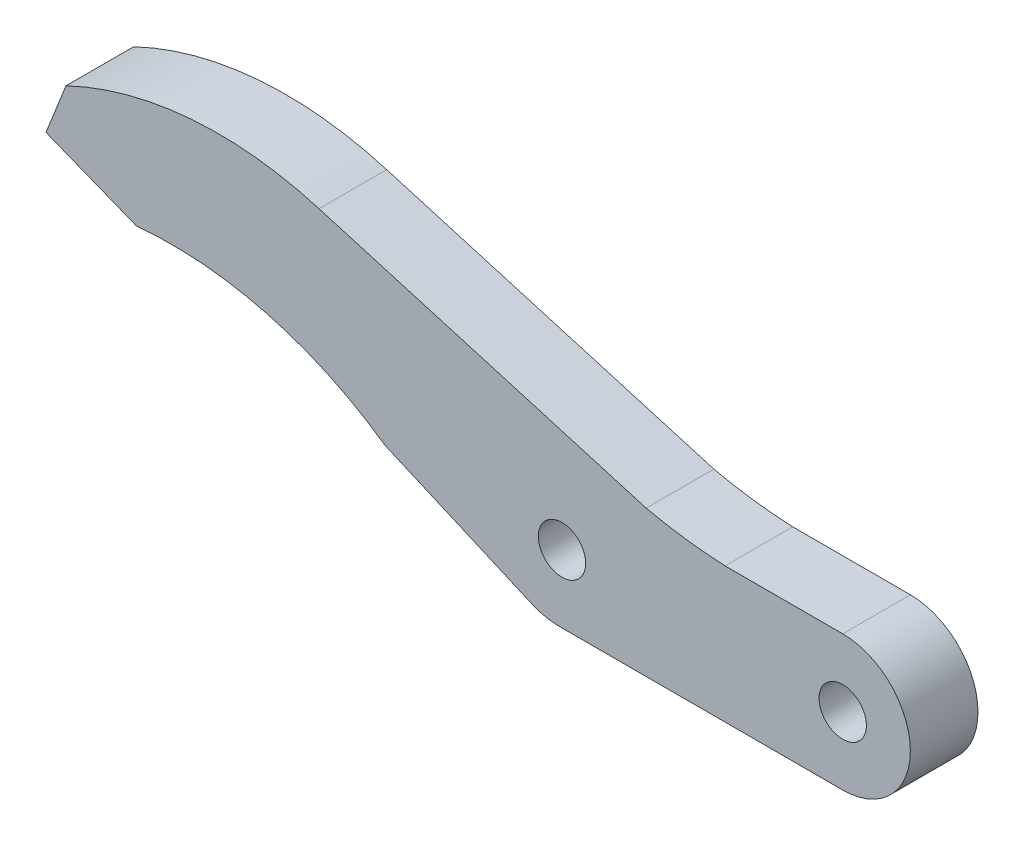
ISO-10303-21;
HEADER;
FILE_DESCRIPTION(('STEP AP214'),'2;1');
FILE_NAME('part.step','',(''),(''),'','','');
FILE_SCHEMA(('AUTOMOTIVE_DESIGN { 1 0 10303 214 1 1 1 1 }'));
ENDSEC;
DATA;
#1=APPLICATION_CONTEXT('core data for automotive mechanical design processes');
#2=APPLICATION_PROTOCOL_DEFINITION('international standard','automotive_design',2000,#1);
#3=PRODUCT_CONTEXT('',#1,'mechanical');
#4=PRODUCT('Part','Part','',(#3));
#5=PRODUCT_RELATED_PRODUCT_CATEGORY('part','',(#4));
#6=PRODUCT_DEFINITION_FORMATION('','',#4);
#7=PRODUCT_DEFINITION_CONTEXT('part definition',#1,'design');
#8=PRODUCT_DEFINITION('design','',#6,#7);
#9=PRODUCT_DEFINITION_SHAPE('','',#8);
#10=(LENGTH_UNIT() NAMED_UNIT(*) SI_UNIT(.MILLI.,.METRE.));
#11=(NAMED_UNIT(*) PLANE_ANGLE_UNIT() SI_UNIT($,.RADIAN.));
#12=(NAMED_UNIT(*) SI_UNIT($,.STERADIAN.) SOLID_ANGLE_UNIT());
#13=UNCERTAINTY_MEASURE_WITH_UNIT(LENGTH_MEASURE(1.E-05),#10,'distance_accuracy_value','');
#14=(GEOMETRIC_REPRESENTATION_CONTEXT(3) GLOBAL_UNCERTAINTY_ASSIGNED_CONTEXT((#13)) GLOBAL_UNIT_ASSIGNED_CONTEXT((#10,
#11,#12)) REPRESENTATION_CONTEXT('',''));
#15=CARTESIAN_POINT('',(0.,0.,0.));
#16=DIRECTION('',(0.,0.,1.));
#17=DIRECTION('',(1.,0.,0.));
#18=AXIS2_PLACEMENT_3D('',#15,#16,#17);
#19=CARTESIAN_POINT('',(-49.5655009596438,-22.2319264601483,5.));
#20=DIRECTION('',(0.,0.,1.));
#21=DIRECTION('',(1.,0.,0.));
#22=AXIS2_PLACEMENT_3D('',#19,#20,#21);
#23=PLANE('',#22);
#24=CARTESIAN_POINT('',(0.,0.,5.));
#25=DIRECTION('',(0.,0.,1.));
#26=DIRECTION('',(1.,0.,0.));
#27=AXIS2_PLACEMENT_3D('',#24,#25,#26);
#28=CIRCLE('',#27,1.74998529864571);
#29=CARTESIAN_POINT('',(1.74998529864571,0.,5.));
#30=VERTEX_POINT('',#29);
#31=EDGE_CURVE('E173',#30,#30,#28,.T.);
#32=ORIENTED_EDGE('',*,*,#31,.F.);
#33=EDGE_LOOP('',(#32));
#34=FACE_BOUND('',#33,.T.);
#35=DIRECTION('',(0.916929046835155,-0.399050276368749,0.));
#36=VECTOR('',#35,1.);
#37=CARTESIAN_POINT('',(-33.8283838458603,0.147779707769994,5.));
#38=LINE('',#37,#36);
#39=CARTESIAN_POINT('',(-33.8283838458603,0.147779707769994,5.));
#40=VERTEX_POINT('',#39);
#41=CARTESIAN_POINT('',(-22.9543922898167,-4.58461409156264,5.));
#42=VERTEX_POINT('',#41);
#43=EDGE_CURVE('E120',#40,#42,#38,.T.);
#44=ORIENTED_EDGE('',*,*,#43,.T.);
#45=CARTESIAN_POINT('',(-20.9591409079729,3.11426131299659E-05,5.));
#46=DIRECTION('',(0.,0.,1.));
#47=DIRECTION('',(1.,0.,0.));
#48=AXIS2_PLACEMENT_3D('',#45,#46,#47);
#49=CIRCLE('',#48,5.);
#50=CARTESIAN_POINT('',(-20.9591409079729,-4.99996885738687,5.));
#51=VERTEX_POINT('',#50);
#52=EDGE_CURVE('E11',#42,#51,#49,.T.);
#53=ORIENTED_EDGE('',*,*,#52,.T.);
#54=DIRECTION('',(1.,0.,0.));
#55=VECTOR('',#54,1.);
#56=CARTESIAN_POINT('',(0.,-4.99996885738687,5.));
#57=LINE('',#56,#55);
#58=CARTESIAN_POINT('',(0.,-4.99996885738687,5.));
#59=VERTEX_POINT('',#58);
#60=EDGE_CURVE('E129',#51,#59,#57,.T.);
#61=ORIENTED_EDGE('',*,*,#60,.T.);
#62=CARTESIAN_POINT('',(0.,0.,5.));
#63=DIRECTION('',(0.,0.,1.));
#64=DIRECTION('',(1.,0.,0.));
#65=AXIS2_PLACEMENT_3D('',#62,#63,#64);
#66=CIRCLE('',#65,4.99996885738686);
#67=CARTESIAN_POINT('',(0.,4.99996885738686,5.));
#68=VERTEX_POINT('',#67);
#69=EDGE_CURVE('E194',#59,#68,#66,.T.);
#70=ORIENTED_EDGE('',*,*,#69,.T.);
#71=DIRECTION('',(-1.,0.,0.));
#72=VECTOR('',#71,1.);
#73=CARTESIAN_POINT('',(0.,4.99996885738686,5.));
#74=LINE('',#73,#72);
#75=CARTESIAN_POINT('',(-8.7,4.99996885738686,5.));
#76=VERTEX_POINT('',#75);
#77=EDGE_CURVE('E197',#68,#76,#74,.T.);
#78=ORIENTED_EDGE('',*,*,#77,.T.);
#79=CARTESIAN_POINT('',(-7.15261933154449,38.5643191872665,5.));
#80=DIRECTION('',(0.,0.,-1.));
#81=DIRECTION('',(-1.,0.,0.));
#82=AXIS2_PLACEMENT_3D('',#79,#80,#81);
#83=CIRCLE('',#82,33.6);
#84=CARTESIAN_POINT('',(-14.5233264252033,5.78272866850905,5.));
#85=VERTEX_POINT('',#84);
#86=EDGE_CURVE('E168',#76,#85,#83,.T.);
#87=ORIENTED_EDGE('',*,*,#86,.T.);
#88=DIRECTION('',(-0.959759160307781,0.280824418819489,0.));
#89=VECTOR('',#88,1.);
#90=CARTESIAN_POINT('',(-38.7092572649595,12.8595040227602,5.));
#91=LINE('',#90,#89);
#92=CARTESIAN_POINT('',(-38.7092572649595,12.8595040227602,5.));
#93=VERTEX_POINT('',#92);
#94=EDGE_CURVE('E165',#85,#93,#91,.T.);
#95=ORIENTED_EDGE('',*,*,#94,.T.);
#96=CARTESIAN_POINT('',(-46.1413277586198,-12.0556385250412,5.));
#97=DIRECTION('',(0.,0.,1.));
#98=DIRECTION('',(1.,0.,0.));
#99=AXIS2_PLACEMENT_3D('',#96,#97,#98);
#100=CIRCLE('',#99,26.);
#101=CARTESIAN_POINT('',(-57.4174023013608,11.3719124119763,5.));
#102=VERTEX_POINT('',#101);
#103=EDGE_CURVE('E167',#93,#102,#100,.T.);
#104=ORIENTED_EDGE('',*,*,#103,.T.);
#105=DIRECTION('',(-0.368541423081734,-0.929611327100144,0.));
#106=VECTOR('',#105,1.);
#107=CARTESIAN_POINT('',(-58.8915679936878,7.65346710357549,5.));
#108=LINE('',#107,#106);
#109=CARTESIAN_POINT('',(-58.8915679936878,7.65346710357549,5.));
#110=VERTEX_POINT('',#109);
#111=EDGE_CURVE('E204',#102,#110,#108,.T.);
#112=ORIENTED_EDGE('',*,*,#111,.T.);
#113=DIRECTION('',(0.929611327100136,-0.368541423081754,0.));
#114=VECTOR('',#113,1.);
#115=CARTESIAN_POINT('',(-52.1983664385668,4.99996885738686,5.));
#116=LINE('',#115,#114);
#117=CARTESIAN_POINT('',(-52.1983664385668,4.99996885738686,5.));
#118=VERTEX_POINT('',#117);
#119=EDGE_CURVE('E135',#110,#118,#116,.T.);
#120=ORIENTED_EDGE('',*,*,#119,.T.);
#121=CARTESIAN_POINT('',(-49.5655009596438,-22.2319264601483,5.));
#122=DIRECTION('',(0.,0.,-1.));
#123=DIRECTION('',(1.,0.,0.));
#124=AXIS2_PLACEMENT_3D('',#121,#122,#123);
#125=CIRCLE('',#124,27.3588761321678);
#126=EDGE_CURVE('E130',#118,#40,#125,.T.);
#127=ORIENTED_EDGE('',*,*,#126,.T.);
#128=EDGE_LOOP('',(#44,#53,#61,#70,#78,#87,#95,#104,#112,#120,#127));
#129=FACE_BOUND('',#128,.T.);
#130=CARTESIAN_POINT('',(-20.75,0.,5.));
#131=DIRECTION('',(0.,0.,1.));
#132=DIRECTION('',(1.,0.,0.));
#133=AXIS2_PLACEMENT_3D('',#130,#131,#132);
#134=CIRCLE('',#133,1.75);
#135=CARTESIAN_POINT('',(-19.,0.,5.));
#136=VERTEX_POINT('',#135);
#137=EDGE_CURVE('E174',#136,#136,#134,.T.);
#138=ORIENTED_EDGE('',*,*,#137,.F.);
#139=EDGE_LOOP('',(#138));
#140=FACE_BOUND('',#139,.T.);
#141=ADVANCED_FACE('F40',(#34,#129,#140),#23,.T.);
#142=CARTESIAN_POINT('',(-49.5655009596438,-22.2319264601483,0.));
#143=DIRECTION('',(0.,0.,1.));
#144=DIRECTION('',(1.,0.,0.));
#145=AXIS2_PLACEMENT_3D('',#142,#143,#144);
#146=PLANE('',#145);
#147=DIRECTION('',(1.,0.,0.));
#148=VECTOR('',#147,1.);
#149=CARTESIAN_POINT('',(0.,-4.99996885738687,0.));
#150=LINE('',#149,#148);
#151=CARTESIAN_POINT('',(-20.9591409079729,-4.99996885738687,0.));
#152=VERTEX_POINT('',#151);
#153=CARTESIAN_POINT('',(0.,-4.99996885738687,0.));
#154=VERTEX_POINT('',#153);
#155=EDGE_CURVE('E214',#152,#154,#150,.T.);
#156=ORIENTED_EDGE('',*,*,#155,.F.);
#157=CARTESIAN_POINT('',(-20.9591409079729,3.11426131299659E-05,0.));
#158=DIRECTION('',(0.,0.,1.));
#159=DIRECTION('',(1.,0.,0.));
#160=AXIS2_PLACEMENT_3D('',#157,#158,#159);
#161=CIRCLE('',#160,5.);
#162=CARTESIAN_POINT('',(-22.9543922898167,-4.58461409156264,0.));
#163=VERTEX_POINT('',#162);
#164=EDGE_CURVE('E63',#152,#163,#161,.F.);
#165=ORIENTED_EDGE('',*,*,#164,.T.);
#166=DIRECTION('',(0.916929046835155,-0.399050276368749,0.));
#167=VECTOR('',#166,1.);
#168=CARTESIAN_POINT('',(-33.8283838458603,0.147779707769994,0.));
#169=LINE('',#168,#167);
#170=CARTESIAN_POINT('',(-33.8283838458603,0.147779707769994,0.));
#171=VERTEX_POINT('',#170);
#172=EDGE_CURVE('E211',#171,#163,#169,.T.);
#173=ORIENTED_EDGE('',*,*,#172,.F.);
#174=CARTESIAN_POINT('',(-49.5655009596438,-22.2319264601483,0.));
#175=DIRECTION('',(0.,0.,-1.));
#176=DIRECTION('',(1.,0.,0.));
#177=AXIS2_PLACEMENT_3D('',#174,#175,#176);
#178=CIRCLE('',#177,27.3588761321678);
#179=CARTESIAN_POINT('',(-52.1983664385668,4.99996885738686,0.));
#180=VERTEX_POINT('',#179);
#181=EDGE_CURVE('E144',#180,#171,#178,.T.);
#182=ORIENTED_EDGE('',*,*,#181,.F.);
#183=DIRECTION('',(0.929611327100136,-0.368541423081754,0.));
#184=VECTOR('',#183,1.);
#185=CARTESIAN_POINT('',(-52.1983664385668,4.99996885738686,0.));
#186=LINE('',#185,#184);
#187=CARTESIAN_POINT('',(-58.8915679936878,7.65346710357549,0.));
#188=VERTEX_POINT('',#187);
#189=EDGE_CURVE('E140',#188,#180,#186,.T.);
#190=ORIENTED_EDGE('',*,*,#189,.F.);
#191=DIRECTION('',(-0.368541423081734,-0.929611327100144,0.));
#192=VECTOR('',#191,1.);
#193=CARTESIAN_POINT('',(-58.8915679936878,7.65346710357549,0.));
#194=LINE('',#193,#192);
#195=CARTESIAN_POINT('',(-57.4174023013608,11.3719124119763,0.));
#196=VERTEX_POINT('',#195);
#197=EDGE_CURVE('E176',#196,#188,#194,.T.);
#198=ORIENTED_EDGE('',*,*,#197,.F.);
#199=CARTESIAN_POINT('',(-46.1413277586198,-12.0556385250412,0.));
#200=DIRECTION('',(0.,0.,1.));
#201=DIRECTION('',(1.,0.,0.));
#202=AXIS2_PLACEMENT_3D('',#199,#200,#201);
#203=CIRCLE('',#202,26.);
#204=CARTESIAN_POINT('',(-38.7092572649595,12.8595040227602,0.));
#205=VERTEX_POINT('',#204);
#206=EDGE_CURVE('E177',#205,#196,#203,.T.);
#207=ORIENTED_EDGE('',*,*,#206,.F.);
#208=DIRECTION('',(-0.959759160307781,0.280824418819489,0.));
#209=VECTOR('',#208,1.);
#210=CARTESIAN_POINT('',(-38.7092572649595,12.8595040227602,0.));
#211=LINE('',#210,#209);
#212=CARTESIAN_POINT('',(-14.5233264252033,5.78272866850905,0.));
#213=VERTEX_POINT('',#212);
#214=EDGE_CURVE('E225',#213,#205,#211,.T.);
#215=ORIENTED_EDGE('',*,*,#214,.F.);
#216=CARTESIAN_POINT('',(-7.15261933154449,38.5643191872665,0.));
#217=DIRECTION('',(0.,0.,-1.));
#218=DIRECTION('',(-1.,0.,0.));
#219=AXIS2_PLACEMENT_3D('',#216,#217,#218);
#220=CIRCLE('',#219,33.6);
#221=CARTESIAN_POINT('',(-8.7,4.99996885738686,0.));
#222=VERTEX_POINT('',#221);
#223=EDGE_CURVE('E223',#222,#213,#220,.T.);
#224=ORIENTED_EDGE('',*,*,#223,.F.);
#225=DIRECTION('',(-1.,0.,0.));
#226=VECTOR('',#225,1.);
#227=CARTESIAN_POINT('',(0.,4.99996885738686,0.));
#228=LINE('',#227,#226);
#229=CARTESIAN_POINT('',(0.,4.99996885738686,0.));
#230=VERTEX_POINT('',#229);
#231=EDGE_CURVE('E220',#230,#222,#228,.T.);
#232=ORIENTED_EDGE('',*,*,#231,.F.);
#233=CARTESIAN_POINT('',(0.,0.,0.));
#234=DIRECTION('',(0.,0.,1.));
#235=DIRECTION('',(1.,0.,0.));
#236=AXIS2_PLACEMENT_3D('',#233,#234,#235);
#237=CIRCLE('',#236,4.99996885738686);
#238=EDGE_CURVE('E217',#154,#230,#237,.T.);
#239=ORIENTED_EDGE('',*,*,#238,.F.);
#240=EDGE_LOOP('',(#156,#165,#173,#182,#190,#198,#207,#215,#224,#232,#239));
#241=FACE_BOUND('',#240,.T.);
#242=CARTESIAN_POINT('',(0.,0.,0.));
#243=DIRECTION('',(0.,0.,1.));
#244=DIRECTION('',(1.,0.,0.));
#245=AXIS2_PLACEMENT_3D('',#242,#243,#244);
#246=CIRCLE('',#245,1.74998529864571);
#247=CARTESIAN_POINT('',(1.74998529864571,0.,0.));
#248=VERTEX_POINT('',#247);
#249=EDGE_CURVE('E170',#248,#248,#246,.T.);
#250=ORIENTED_EDGE('',*,*,#249,.T.);
#251=EDGE_LOOP('',(#250));
#252=FACE_BOUND('',#251,.T.);
#253=CARTESIAN_POINT('',(-20.75,0.,0.));
#254=DIRECTION('',(0.,0.,1.));
#255=DIRECTION('',(1.,0.,0.));
#256=AXIS2_PLACEMENT_3D('',#253,#254,#255);
#257=CIRCLE('',#256,1.75);
#258=CARTESIAN_POINT('',(-19.,0.,0.));
#259=VERTEX_POINT('',#258);
#260=EDGE_CURVE('E180',#259,#259,#257,.T.);
#261=ORIENTED_EDGE('',*,*,#260,.T.);
#262=EDGE_LOOP('',(#261));
#263=FACE_BOUND('',#262,.T.);
#264=ADVANCED_FACE('F263',(#241,#252,#263),#146,.F.);
#265=CARTESIAN_POINT('',(-49.5655009596438,-22.2319264601483,5.));
#266=DIRECTION('',(0.,0.,-1.));
#267=DIRECTION('',(-1.,0.,0.));
#268=AXIS2_PLACEMENT_3D('',#265,#266,#267);
#269=CYLINDRICAL_SURFACE('',#268,27.3588761321678);
#270=ORIENTED_EDGE('',*,*,#181,.T.);
#271=DIRECTION('',(0.,0.,-1.));
#272=VECTOR('',#271,1.);
#273=CARTESIAN_POINT('',(-33.8283838458603,0.147779707769994,5.));
#274=LINE('',#273,#272);
#275=EDGE_CURVE('E124',#40,#171,#274,.T.);
#276=ORIENTED_EDGE('',*,*,#275,.F.);
#277=ORIENTED_EDGE('',*,*,#126,.F.);
#278=DIRECTION('',(0.,0.,-1.));
#279=VECTOR('',#278,1.);
#280=CARTESIAN_POINT('',(-52.1983664385668,4.99996885738686,5.));
#281=LINE('',#280,#279);
#282=EDGE_CURVE('E208',#118,#180,#281,.T.);
#283=ORIENTED_EDGE('',*,*,#282,.T.);
#284=EDGE_LOOP('',(#270,#276,#277,#283));
#285=FACE_BOUND('',#284,.T.);
#286=ADVANCED_FACE('F142',(#285),#269,.F.);
#287=CARTESIAN_POINT('',(-33.8283838458603,0.147779707769994,5.));
#288=DIRECTION('',(0.399050276368749,0.916929046835155,0.));
#289=DIRECTION('',(-0.916929046835155,0.399050276368749,0.));
#290=AXIS2_PLACEMENT_3D('',#287,#288,#289);
#291=PLANE('',#290);
#292=ORIENTED_EDGE('',*,*,#172,.T.);
#293=DIRECTION('',(0.,0.,-1.));
#294=VECTOR('',#293,1.);
#295=CARTESIAN_POINT('',(-22.9543922898167,-4.58461409156264,5.));
#296=LINE('',#295,#294);
#297=EDGE_CURVE('E49',#163,#42,#296,.F.);
#298=ORIENTED_EDGE('',*,*,#297,.T.);
#299=ORIENTED_EDGE('',*,*,#43,.F.);
#300=ORIENTED_EDGE('',*,*,#275,.T.);
#301=EDGE_LOOP('',(#292,#298,#299,#300));
#302=FACE_BOUND('',#301,.T.);
#303=ADVANCED_FACE('F122',(#302),#291,.F.);
#304=CARTESIAN_POINT('',(0.,-4.99996885738687,5.));
#305=DIRECTION('',(0.,1.,0.));
#306=DIRECTION('',(-1.,0.,0.));
#307=AXIS2_PLACEMENT_3D('',#304,#305,#306);
#308=PLANE('',#307);
#309=ORIENTED_EDGE('',*,*,#60,.F.);
#310=DIRECTION('',(0.,0.,-1.));
#311=VECTOR('',#310,1.);
#312=CARTESIAN_POINT('',(-20.9591409079729,-4.99996885738687,5.));
#313=LINE('',#312,#311);
#314=EDGE_CURVE('E146',#51,#152,#313,.T.);
#315=ORIENTED_EDGE('',*,*,#314,.T.);
#316=ORIENTED_EDGE('',*,*,#155,.T.);
#317=DIRECTION('',(0.,0.,-1.));
#318=VECTOR('',#317,1.);
#319=CARTESIAN_POINT('',(0.,-4.99996885738687,5.));
#320=LINE('',#319,#318);
#321=EDGE_CURVE('E147',#59,#154,#320,.T.);
#322=ORIENTED_EDGE('',*,*,#321,.F.);
#323=EDGE_LOOP('',(#309,#315,#316,#322));
#324=FACE_BOUND('',#323,.T.);
#325=ADVANCED_FACE('F281',(#324),#308,.F.);
#326=CARTESIAN_POINT('',(0.,0.,5.));
#327=DIRECTION('',(0.,0.,-1.));
#328=DIRECTION('',(-1.,0.,0.));
#329=AXIS2_PLACEMENT_3D('',#326,#327,#328);
#330=CYLINDRICAL_SURFACE('',#329,4.99996885738686);
#331=ORIENTED_EDGE('',*,*,#238,.T.);
#332=DIRECTION('',(0.,0.,-1.));
#333=VECTOR('',#332,1.);
#334=CARTESIAN_POINT('',(0.,4.99996885738686,5.));
#335=LINE('',#334,#333);
#336=EDGE_CURVE('E156',#68,#230,#335,.T.);
#337=ORIENTED_EDGE('',*,*,#336,.F.);
#338=ORIENTED_EDGE('',*,*,#69,.F.);
#339=ORIENTED_EDGE('',*,*,#321,.T.);
#340=EDGE_LOOP('',(#331,#337,#338,#339));
#341=FACE_BOUND('',#340,.T.);
#342=ADVANCED_FACE('F279',(#341),#330,.T.);
#343=CARTESIAN_POINT('',(0.,4.99996885738686,5.));
#344=DIRECTION('',(0.,-1.,0.));
#345=DIRECTION('',(1.,0.,0.));
#346=AXIS2_PLACEMENT_3D('',#343,#344,#345);
#347=PLANE('',#346);
#348=ORIENTED_EDGE('',*,*,#231,.T.);
#349=DIRECTION('',(0.,0.,-1.));
#350=VECTOR('',#349,1.);
#351=CARTESIAN_POINT('',(-8.7,4.99996885738686,5.));
#352=LINE('',#351,#350);
#353=EDGE_CURVE('E248',#76,#222,#352,.T.);
#354=ORIENTED_EDGE('',*,*,#353,.F.);
#355=ORIENTED_EDGE('',*,*,#77,.F.);
#356=ORIENTED_EDGE('',*,*,#336,.T.);
#357=EDGE_LOOP('',(#348,#354,#355,#356));
#358=FACE_BOUND('',#357,.T.);
#359=ADVANCED_FACE('F257',(#358),#347,.F.);
#360=CARTESIAN_POINT('',(-7.15261933154449,38.5643191872665,5.));
#361=DIRECTION('',(0.,0.,-1.));
#362=DIRECTION('',(-1.,0.,0.));
#363=AXIS2_PLACEMENT_3D('',#360,#361,#362);
#364=CYLINDRICAL_SURFACE('',#363,33.6);
#365=ORIENTED_EDGE('',*,*,#223,.T.);
#366=DIRECTION('',(0.,0.,-1.));
#367=VECTOR('',#366,1.);
#368=CARTESIAN_POINT('',(-14.5233264252033,5.78272866850905,5.));
#369=LINE('',#368,#367);
#370=EDGE_CURVE('E244',#85,#213,#369,.T.);
#371=ORIENTED_EDGE('',*,*,#370,.F.);
#372=ORIENTED_EDGE('',*,*,#86,.F.);
#373=ORIENTED_EDGE('',*,*,#353,.T.);
#374=EDGE_LOOP('',(#365,#371,#372,#373));
#375=FACE_BOUND('',#374,.T.);
#376=ADVANCED_FACE('F269',(#375),#364,.F.);
#377=CARTESIAN_POINT('',(-38.7092572649595,12.8595040227602,5.));
#378=DIRECTION('',(-0.280824418819489,-0.959759160307781,0.));
#379=DIRECTION('',(0.959759160307781,-0.280824418819489,0.));
#380=AXIS2_PLACEMENT_3D('',#377,#378,#379);
#381=PLANE('',#380);
#382=ORIENTED_EDGE('',*,*,#214,.T.);
#383=DIRECTION('',(0.,0.,-1.));
#384=VECTOR('',#383,1.);
#385=CARTESIAN_POINT('',(-38.7092572649595,12.8595040227602,5.));
#386=LINE('',#385,#384);
#387=EDGE_CURVE('E163',#93,#205,#386,.T.);
#388=ORIENTED_EDGE('',*,*,#387,.F.);
#389=ORIENTED_EDGE('',*,*,#94,.F.);
#390=ORIENTED_EDGE('',*,*,#370,.T.);
#391=EDGE_LOOP('',(#382,#388,#389,#390));
#392=FACE_BOUND('',#391,.T.);
#393=ADVANCED_FACE('F273',(#392),#381,.F.);
#394=CARTESIAN_POINT('',(-46.1413277586198,-12.0556385250412,5.));
#395=DIRECTION('',(0.,0.,-1.));
#396=DIRECTION('',(-1.,0.,0.));
#397=AXIS2_PLACEMENT_3D('',#394,#395,#396);
#398=CYLINDRICAL_SURFACE('',#397,26.);
#399=ORIENTED_EDGE('',*,*,#206,.T.);
#400=DIRECTION('',(0.,0.,-1.));
#401=VECTOR('',#400,1.);
#402=CARTESIAN_POINT('',(-57.4174023013608,11.3719124119763,5.));
#403=LINE('',#402,#401);
#404=EDGE_CURVE('E238',#102,#196,#403,.T.);
#405=ORIENTED_EDGE('',*,*,#404,.F.);
#406=ORIENTED_EDGE('',*,*,#103,.F.);
#407=ORIENTED_EDGE('',*,*,#387,.T.);
#408=EDGE_LOOP('',(#399,#405,#406,#407));
#409=FACE_BOUND('',#408,.T.);
#410=ADVANCED_FACE('F309',(#409),#398,.T.);
#411=CARTESIAN_POINT('',(-58.8915679936878,7.65346710357549,5.));
#412=DIRECTION('',(0.929611327100144,-0.368541423081734,0.));
#413=DIRECTION('',(0.368541423081734,0.929611327100144,0.));
#414=AXIS2_PLACEMENT_3D('',#411,#412,#413);
#415=PLANE('',#414);
#416=ORIENTED_EDGE('',*,*,#197,.T.);
#417=DIRECTION('',(0.,0.,-1.));
#418=VECTOR('',#417,1.);
#419=CARTESIAN_POINT('',(-58.8915679936878,7.65346710357549,5.));
#420=LINE('',#419,#418);
#421=EDGE_CURVE('E234',#110,#188,#420,.T.);
#422=ORIENTED_EDGE('',*,*,#421,.F.);
#423=ORIENTED_EDGE('',*,*,#111,.F.);
#424=ORIENTED_EDGE('',*,*,#404,.T.);
#425=EDGE_LOOP('',(#416,#422,#423,#424));
#426=FACE_BOUND('',#425,.T.);
#427=ADVANCED_FACE('F305',(#426),#415,.F.);
#428=CARTESIAN_POINT('',(-52.1983664385668,4.99996885738686,5.));
#429=DIRECTION('',(0.368541423081754,0.929611327100136,0.));
#430=DIRECTION('',(-0.929611327100136,0.368541423081754,0.));
#431=AXIS2_PLACEMENT_3D('',#428,#429,#430);
#432=PLANE('',#431);
#433=ORIENTED_EDGE('',*,*,#189,.T.);
#434=ORIENTED_EDGE('',*,*,#282,.F.);
#435=ORIENTED_EDGE('',*,*,#119,.F.);
#436=ORIENTED_EDGE('',*,*,#421,.T.);
#437=EDGE_LOOP('',(#433,#434,#435,#436));
#438=FACE_BOUND('',#437,.T.);
#439=ADVANCED_FACE('F302',(#438),#432,.F.);
#440=CARTESIAN_POINT('',(0.,0.,5.));
#441=DIRECTION('',(0.,0.,-1.));
#442=DIRECTION('',(-1.,0.,0.));
#443=AXIS2_PLACEMENT_3D('',#440,#441,#442);
#444=CYLINDRICAL_SURFACE('',#443,1.74998529864571);
#445=ORIENTED_EDGE('',*,*,#31,.T.);
#446=EDGE_LOOP('',(#445));
#447=FACE_BOUND('',#446,.T.);
#448=ORIENTED_EDGE('',*,*,#249,.F.);
#449=EDGE_LOOP('',(#448));
#450=FACE_BOUND('',#449,.T.);
#451=ADVANCED_FACE('F289',(#447,#450),#444,.F.);
#452=CARTESIAN_POINT('',(-20.75,0.,5.));
#453=DIRECTION('',(0.,0.,-1.));
#454=DIRECTION('',(-1.,0.,0.));
#455=AXIS2_PLACEMENT_3D('',#452,#453,#454);
#456=CYLINDRICAL_SURFACE('',#455,1.75);
#457=ORIENTED_EDGE('',*,*,#137,.T.);
#458=EDGE_LOOP('',(#457));
#459=FACE_BOUND('',#458,.T.);
#460=ORIENTED_EDGE('',*,*,#260,.F.);
#461=EDGE_LOOP('',(#460));
#462=FACE_BOUND('',#461,.T.);
#463=ADVANCED_FACE('F285',(#459,#462),#456,.F.);
#464=CARTESIAN_POINT('',(-20.9591409079729,3.11426131299659E-05,5.));
#465=DIRECTION('',(0.,0.,-1.));
#466=DIRECTION('',(-1.,0.,0.));
#467=AXIS2_PLACEMENT_3D('',#464,#465,#466);
#468=CYLINDRICAL_SURFACE('',#467,5.);
#469=ORIENTED_EDGE('',*,*,#52,.F.);
#470=ORIENTED_EDGE('',*,*,#297,.F.);
#471=ORIENTED_EDGE('',*,*,#164,.F.);
#472=ORIENTED_EDGE('',*,*,#314,.F.);
#473=EDGE_LOOP('',(#469,#470,#471,#472));
#474=FACE_BOUND('',#473,.T.);
#475=ADVANCED_FACE('F42',(#474),#468,.T.);
#476=CLOSED_SHELL('',(#141,#264,#286,#303,#325,#342,#359,#376,#393,#410,#427,#439,#451,#463,#475));
#477=MANIFOLD_SOLID_BREP('B2',#476);
#478=ADVANCED_BREP_SHAPE_REPRESENTATION('',(#18,#477),#14);
#479=SHAPE_DEFINITION_REPRESENTATION(#9,#478);
ENDSEC;
END-ISO-10303-21;
